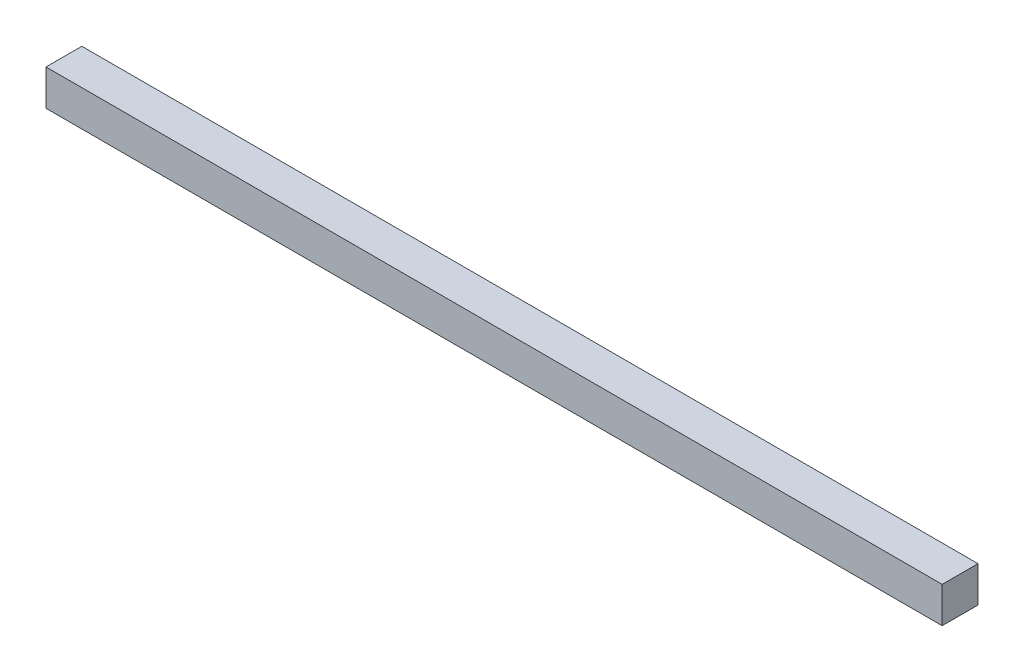
ISO-10303-21;
HEADER;
FILE_DESCRIPTION(('STEP AP214'),'2;1');
FILE_NAME('part.step','',(''),(''),'','','');
FILE_SCHEMA(('AUTOMOTIVE_DESIGN { 1 0 10303 214 1 1 1 1 }'));
ENDSEC;
DATA;
#1=APPLICATION_CONTEXT('core data for automotive mechanical design processes');
#2=APPLICATION_PROTOCOL_DEFINITION('international standard','automotive_design',2000,#1);
#3=PRODUCT_CONTEXT('',#1,'mechanical');
#4=PRODUCT('Part','Part','',(#3));
#5=PRODUCT_RELATED_PRODUCT_CATEGORY('part','',(#4));
#6=PRODUCT_DEFINITION_FORMATION('','',#4);
#7=PRODUCT_DEFINITION_CONTEXT('part definition',#1,'design');
#8=PRODUCT_DEFINITION('design','',#6,#7);
#9=PRODUCT_DEFINITION_SHAPE('','',#8);
#10=(LENGTH_UNIT() NAMED_UNIT(*) SI_UNIT(.MILLI.,.METRE.));
#11=(NAMED_UNIT(*) PLANE_ANGLE_UNIT() SI_UNIT($,.RADIAN.));
#12=(NAMED_UNIT(*) SI_UNIT($,.STERADIAN.) SOLID_ANGLE_UNIT());
#13=UNCERTAINTY_MEASURE_WITH_UNIT(LENGTH_MEASURE(1.E-05),#10,'distance_accuracy_value','');
#14=(GEOMETRIC_REPRESENTATION_CONTEXT(3) GLOBAL_UNCERTAINTY_ASSIGNED_CONTEXT((#13)) GLOBAL_UNIT_ASSIGNED_CONTEXT((#10,
#11,#12)) REPRESENTATION_CONTEXT('',''));
#15=CARTESIAN_POINT('',(0.,0.,0.));
#16=DIRECTION('',(0.,0.,1.));
#17=DIRECTION('',(1.,0.,0.));
#18=AXIS2_PLACEMENT_3D('',#15,#16,#17);
#19=CARTESIAN_POINT('',(1250.,50.,-50.));
#20=DIRECTION('',(0.,0.,1.));
#21=DIRECTION('',(0.,-1.,0.));
#22=AXIS2_PLACEMENT_3D('',#19,#20,#21);
#23=PLANE('',#22);
#24=DIRECTION('',(0.,1.,0.));
#25=VECTOR('',#24,1.);
#26=CARTESIAN_POINT('',(-1250.,50.,-50.));
#27=LINE('',#26,#25);
#28=CARTESIAN_POINT('',(-1250.,-50.,-50.));
#29=VERTEX_POINT('',#28);
#30=CARTESIAN_POINT('',(-1250.,50.,-50.));
#31=VERTEX_POINT('',#30);
#32=EDGE_CURVE('E100',#29,#31,#27,.T.);
#33=ORIENTED_EDGE('',*,*,#32,.T.);
#34=DIRECTION('',(-1.,0.,0.));
#35=VECTOR('',#34,1.);
#36=CARTESIAN_POINT('',(1250.,50.,-50.));
#37=LINE('',#36,#35);
#38=CARTESIAN_POINT('',(1250.,50.,-50.));
#39=VERTEX_POINT('',#38);
#40=EDGE_CURVE('E11',#39,#31,#37,.T.);
#41=ORIENTED_EDGE('',*,*,#40,.F.);
#42=DIRECTION('',(0.,1.,0.));
#43=VECTOR('',#42,1.);
#44=CARTESIAN_POINT('',(1250.,50.,-50.));
#45=LINE('',#44,#43);
#46=CARTESIAN_POINT('',(1250.,-50.,-50.));
#47=VERTEX_POINT('',#46);
#48=EDGE_CURVE('E88',#47,#39,#45,.T.);
#49=ORIENTED_EDGE('',*,*,#48,.F.);
#50=DIRECTION('',(-1.,0.,0.));
#51=VECTOR('',#50,1.);
#52=CARTESIAN_POINT('',(1250.,-50.,-50.));
#53=LINE('',#52,#51);
#54=EDGE_CURVE('E96',#47,#29,#53,.T.);
#55=ORIENTED_EDGE('',*,*,#54,.T.);
#56=EDGE_LOOP('',(#33,#41,#49,#55));
#57=FACE_BOUND('',#56,.T.);
#58=ADVANCED_FACE('F37',(#57),#23,.F.);
#59=CARTESIAN_POINT('',(1250.,50.,50.));
#60=DIRECTION('',(0.,-1.,0.));
#61=DIRECTION('',(0.,0.,-1.));
#62=AXIS2_PLACEMENT_3D('',#59,#60,#61);
#63=PLANE('',#62);
#64=DIRECTION('',(0.,0.,1.));
#65=VECTOR('',#64,1.);
#66=CARTESIAN_POINT('',(-1250.,50.,50.));
#67=LINE('',#66,#65);
#68=CARTESIAN_POINT('',(-1250.,50.,50.));
#69=VERTEX_POINT('',#68);
#70=EDGE_CURVE('E92',#31,#69,#67,.T.);
#71=ORIENTED_EDGE('',*,*,#70,.T.);
#72=DIRECTION('',(-1.,0.,0.));
#73=VECTOR('',#72,1.);
#74=CARTESIAN_POINT('',(1250.,50.,50.));
#75=LINE('',#74,#73);
#76=CARTESIAN_POINT('',(1250.,50.,50.));
#77=VERTEX_POINT('',#76);
#78=EDGE_CURVE('E45',#77,#69,#75,.T.);
#79=ORIENTED_EDGE('',*,*,#78,.F.);
#80=DIRECTION('',(0.,0.,1.));
#81=VECTOR('',#80,1.);
#82=CARTESIAN_POINT('',(1250.,50.,50.));
#83=LINE('',#82,#81);
#84=EDGE_CURVE('E83',#39,#77,#83,.T.);
#85=ORIENTED_EDGE('',*,*,#84,.F.);
#86=ORIENTED_EDGE('',*,*,#40,.T.);
#87=EDGE_LOOP('',(#71,#79,#85,#86));
#88=FACE_BOUND('',#87,.T.);
#89=ADVANCED_FACE('F91',(#88),#63,.F.);
#90=CARTESIAN_POINT('',(1250.,50.,50.));
#91=DIRECTION('',(0.,0.,-1.));
#92=DIRECTION('',(0.,1.,0.));
#93=AXIS2_PLACEMENT_3D('',#90,#91,#92);
#94=PLANE('',#93);
#95=DIRECTION('',(0.,-1.,0.));
#96=VECTOR('',#95,1.);
#97=CARTESIAN_POINT('',(-1250.,50.,50.));
#98=LINE('',#97,#96);
#99=CARTESIAN_POINT('',(-1250.,-50.,50.));
#100=VERTEX_POINT('',#99);
#101=EDGE_CURVE('E70',#69,#100,#98,.T.);
#102=ORIENTED_EDGE('',*,*,#101,.T.);
#103=DIRECTION('',(-1.,0.,0.));
#104=VECTOR('',#103,1.);
#105=CARTESIAN_POINT('',(1250.,-50.,50.));
#106=LINE('',#105,#104);
#107=CARTESIAN_POINT('',(1250.,-50.,50.));
#108=VERTEX_POINT('',#107);
#109=EDGE_CURVE('E93',#108,#100,#106,.T.);
#110=ORIENTED_EDGE('',*,*,#109,.F.);
#111=DIRECTION('',(0.,-1.,0.));
#112=VECTOR('',#111,1.);
#113=CARTESIAN_POINT('',(1250.,50.,50.));
#114=LINE('',#113,#112);
#115=EDGE_CURVE('E86',#77,#108,#114,.T.);
#116=ORIENTED_EDGE('',*,*,#115,.F.);
#117=ORIENTED_EDGE('',*,*,#78,.T.);
#118=EDGE_LOOP('',(#102,#110,#116,#117));
#119=FACE_BOUND('',#118,.T.);
#120=ADVANCED_FACE('F94',(#119),#94,.F.);
#121=CARTESIAN_POINT('',(1250.,-50.,50.));
#122=DIRECTION('',(0.,1.,0.));
#123=DIRECTION('',(0.,0.,1.));
#124=AXIS2_PLACEMENT_3D('',#121,#122,#123);
#125=PLANE('',#124);
#126=DIRECTION('',(0.,0.,-1.));
#127=VECTOR('',#126,1.);
#128=CARTESIAN_POINT('',(-1250.,-50.,50.));
#129=LINE('',#128,#127);
#130=EDGE_CURVE('E76',#100,#29,#129,.T.);
#131=ORIENTED_EDGE('',*,*,#130,.T.);
#132=ORIENTED_EDGE('',*,*,#54,.F.);
#133=DIRECTION('',(0.,0.,-1.));
#134=VECTOR('',#133,1.);
#135=CARTESIAN_POINT('',(1250.,-50.,50.));
#136=LINE('',#135,#134);
#137=EDGE_CURVE('E53',#108,#47,#136,.T.);
#138=ORIENTED_EDGE('',*,*,#137,.F.);
#139=ORIENTED_EDGE('',*,*,#109,.T.);
#140=EDGE_LOOP('',(#131,#132,#138,#139));
#141=FACE_BOUND('',#140,.T.);
#142=ADVANCED_FACE('F107',(#141),#125,.F.);
#143=CARTESIAN_POINT('',(1250.,0.,0.));
#144=DIRECTION('',(1.,0.,0.));
#145=DIRECTION('',(0.,0.,-1.));
#146=AXIS2_PLACEMENT_3D('',#143,#144,#145);
#147=PLANE('',#146);
#148=ORIENTED_EDGE('',*,*,#48,.T.);
#149=ORIENTED_EDGE('',*,*,#84,.T.);
#150=ORIENTED_EDGE('',*,*,#115,.T.);
#151=ORIENTED_EDGE('',*,*,#137,.T.);
#152=EDGE_LOOP('',(#148,#149,#150,#151));
#153=FACE_BOUND('',#152,.T.);
#154=ADVANCED_FACE('F84',(#153),#147,.T.);
#155=CARTESIAN_POINT('',(-1250.,0.,0.));
#156=DIRECTION('',(1.,0.,0.));
#157=DIRECTION('',(0.,0.,-1.));
#158=AXIS2_PLACEMENT_3D('',#155,#156,#157);
#159=PLANE('',#158);
#160=ORIENTED_EDGE('',*,*,#32,.F.);
#161=ORIENTED_EDGE('',*,*,#130,.F.);
#162=ORIENTED_EDGE('',*,*,#101,.F.);
#163=ORIENTED_EDGE('',*,*,#70,.F.);
#164=EDGE_LOOP('',(#160,#161,#162,#163));
#165=FACE_BOUND('',#164,.T.);
#166=ADVANCED_FACE('F110',(#165),#159,.F.);
#167=CLOSED_SHELL('',(#58,#89,#120,#142,#154,#166));
#168=MANIFOLD_SOLID_BREP('B2',#167);
#169=ADVANCED_BREP_SHAPE_REPRESENTATION('',(#18,#168),#14);
#170=SHAPE_DEFINITION_REPRESENTATION(#9,#169);
ENDSEC;
END-ISO-10303-21;
